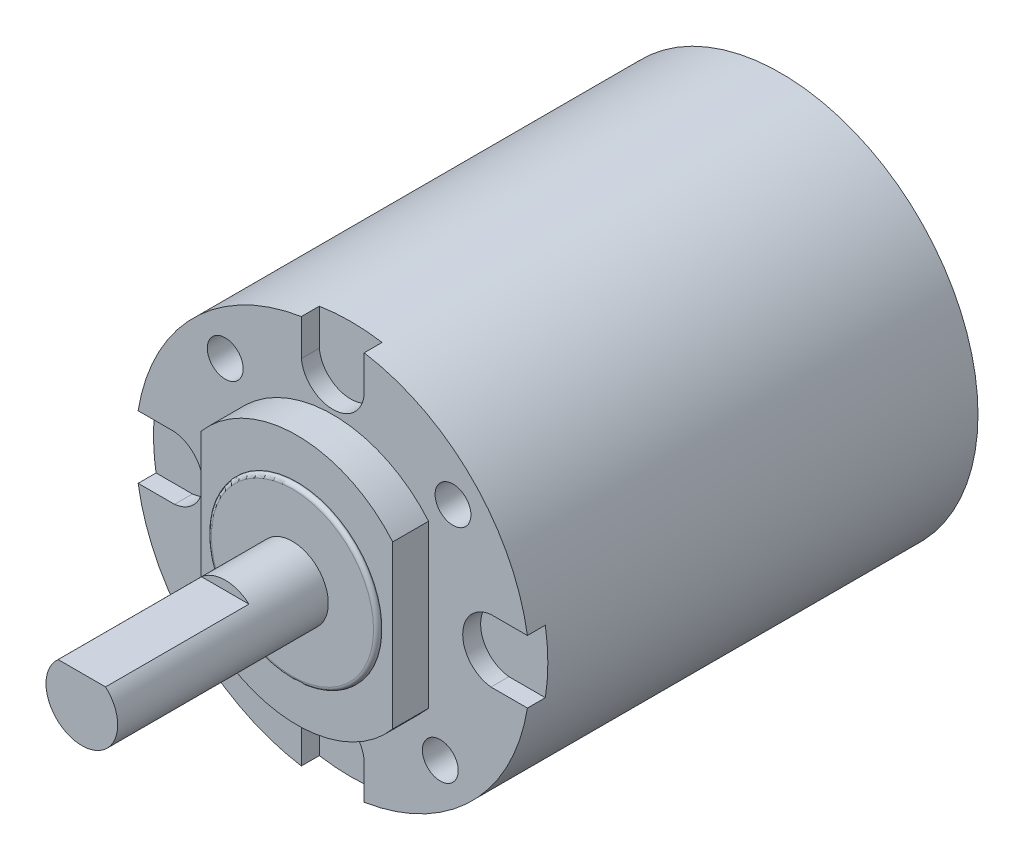
ISO-10303-21;
HEADER;
FILE_DESCRIPTION(('STEP AP214'),'2;1');
FILE_NAME('part.step','',(''),(''),'','','');
FILE_SCHEMA(('AUTOMOTIVE_DESIGN { 1 0 10303 214 1 1 1 1 }'));
ENDSEC;
DATA;
#1=APPLICATION_CONTEXT('core data for automotive mechanical design processes');
#2=APPLICATION_PROTOCOL_DEFINITION('international standard','automotive_design',2000,#1);
#3=PRODUCT_CONTEXT('',#1,'mechanical');
#4=PRODUCT('Part','Part','',(#3));
#5=PRODUCT_RELATED_PRODUCT_CATEGORY('part','',(#4));
#6=PRODUCT_DEFINITION_FORMATION('','',#4);
#7=PRODUCT_DEFINITION_CONTEXT('part definition',#1,'design');
#8=PRODUCT_DEFINITION('design','',#6,#7);
#9=PRODUCT_DEFINITION_SHAPE('','',#8);
#10=(LENGTH_UNIT() NAMED_UNIT(*) SI_UNIT(.MILLI.,.METRE.));
#11=(NAMED_UNIT(*) PLANE_ANGLE_UNIT() SI_UNIT($,.RADIAN.));
#12=(NAMED_UNIT(*) SI_UNIT($,.STERADIAN.) SOLID_ANGLE_UNIT());
#13=UNCERTAINTY_MEASURE_WITH_UNIT(LENGTH_MEASURE(1.E-05),#10,'distance_accuracy_value','');
#14=(GEOMETRIC_REPRESENTATION_CONTEXT(3) GLOBAL_UNCERTAINTY_ASSIGNED_CONTEXT((#13)) GLOBAL_UNIT_ASSIGNED_CONTEXT((#10,
#11,#12)) REPRESENTATION_CONTEXT('',''));
#15=CARTESIAN_POINT('',(0.,0.,0.));
#16=DIRECTION('',(0.,0.,1.));
#17=DIRECTION('',(1.,0.,0.));
#18=AXIS2_PLACEMENT_3D('',#15,#16,#17);
#19=CARTESIAN_POINT('',(0.,0.,39.000000376));
#20=DIRECTION('',(0.,0.,1.));
#21=DIRECTION('',(1.,0.,0.));
#22=AXIS2_PLACEMENT_3D('',#19,#20,#21);
#23=PLANE('',#22);
#24=CARTESIAN_POINT('',(0.,0.,39.000000376));
#25=DIRECTION('',(0.,0.,-1.));
#26=DIRECTION('',(-1.,0.,0.));
#27=AXIS2_PLACEMENT_3D('',#24,#25,#26);
#28=CIRCLE('',#27,2.);
#29=CARTESIAN_POINT('',(1.3228756555323,1.5,39.000000376));
#30=VERTEX_POINT('',#29);
#31=CARTESIAN_POINT('',(-1.3228756555323,1.5,39.000000376));
#32=VERTEX_POINT('',#31);
#33=EDGE_CURVE('E167',#30,#32,#28,.T.);
#34=ORIENTED_EDGE('',*,*,#33,.F.);
#35=DIRECTION('',(1.,0.,0.));
#36=VECTOR('',#35,1.);
#37=CARTESIAN_POINT('',(-1.3228756555323,1.5,39.000000376));
#38=LINE('',#37,#36);
#39=EDGE_CURVE('E178',#30,#32,#38,.F.);
#40=ORIENTED_EDGE('',*,*,#39,.T.);
#41=EDGE_LOOP('',(#34,#40));
#42=FACE_BOUND('',#41,.T.);
#43=ADVANCED_FACE('F16',(#42),#23,.T.);
#44=CARTESIAN_POINT('',(0.,0.,31.000000376));
#45=DIRECTION('',(0.,0.,-1.));
#46=DIRECTION('',(-1.,0.,0.));
#47=AXIS2_PLACEMENT_3D('',#44,#45,#46);
#48=PLANE('',#47);
#49=DIRECTION('',(1.,0.,0.));
#50=VECTOR('',#49,1.);
#51=CARTESIAN_POINT('',(-1.3228756555323,1.5,31.000000376));
#52=LINE('',#51,#50);
#53=CARTESIAN_POINT('',(-1.3228756555323,1.5,31.000000376));
#54=VERTEX_POINT('',#53);
#55=CARTESIAN_POINT('',(1.3228756555323,1.5,31.000000376));
#56=VERTEX_POINT('',#55);
#57=EDGE_CURVE('E181',#54,#56,#52,.T.);
#58=ORIENTED_EDGE('',*,*,#57,.T.);
#59=CARTESIAN_POINT('',(0.,0.,31.000000376));
#60=DIRECTION('',(0.,0.,-1.));
#61=DIRECTION('',(-1.,0.,0.));
#62=AXIS2_PLACEMENT_3D('',#59,#60,#61);
#63=CIRCLE('',#62,2.);
#64=EDGE_CURVE('E185',#54,#56,#63,.T.);
#65=ORIENTED_EDGE('',*,*,#64,.F.);
#66=EDGE_LOOP('',(#58,#65));
#67=FACE_BOUND('',#66,.T.);
#68=ADVANCED_FACE('F342',(#67),#48,.F.);
#69=CARTESIAN_POINT('',(-1.3228756555323,1.5,31.000000376));
#70=DIRECTION('',(0.,-1.,0.));
#71=DIRECTION('',(0.,0.,-1.));
#72=AXIS2_PLACEMENT_3D('',#69,#70,#71);
#73=PLANE('',#72);
#74=DIRECTION('',(0.,0.,-1.));
#75=VECTOR('',#74,1.);
#76=CARTESIAN_POINT('',(1.3228756555323,1.5,39.000000376));
#77=LINE('',#76,#75);
#78=EDGE_CURVE('E177',#56,#30,#77,.F.);
#79=ORIENTED_EDGE('',*,*,#78,.F.);
#80=ORIENTED_EDGE('',*,*,#57,.F.);
#81=DIRECTION('',(0.,0.,-1.));
#82=VECTOR('',#81,1.);
#83=CARTESIAN_POINT('',(-1.3228756555323,1.5,39.000000376));
#84=LINE('',#83,#82);
#85=EDGE_CURVE('E175',#32,#54,#84,.T.);
#86=ORIENTED_EDGE('',*,*,#85,.F.);
#87=ORIENTED_EDGE('',*,*,#39,.F.);
#88=EDGE_LOOP('',(#79,#80,#86,#87));
#89=FACE_BOUND('',#88,.T.);
#90=ADVANCED_FACE('F183',(#89),#73,.F.);
#91=CARTESIAN_POINT('',(0.,0.,39.000000376));
#92=DIRECTION('',(0.,0.,-1.));
#93=DIRECTION('',(-1.,0.,0.));
#94=AXIS2_PLACEMENT_3D('',#91,#92,#93);
#95=CYLINDRICAL_SURFACE('',#94,2.);
#96=CARTESIAN_POINT('',(0.,0.,27.25));
#97=DIRECTION('',(0.,0.,-1.));
#98=DIRECTION('',(-1.,0.,0.));
#99=AXIS2_PLACEMENT_3D('',#96,#97,#98);
#100=CIRCLE('',#99,2.);
#101=CARTESIAN_POINT('',(-2.,0.,27.25));
#102=VERTEX_POINT('',#101);
#103=EDGE_CURVE('E194',#102,#102,#100,.T.);
#104=ORIENTED_EDGE('',*,*,#103,.F.);
#105=EDGE_LOOP('',(#104));
#106=FACE_BOUND('',#105,.T.);
#107=ORIENTED_EDGE('',*,*,#64,.T.);
#108=ORIENTED_EDGE('',*,*,#78,.T.);
#109=ORIENTED_EDGE('',*,*,#33,.T.);
#110=ORIENTED_EDGE('',*,*,#85,.T.);
#111=EDGE_LOOP('',(#107,#108,#109,#110));
#112=FACE_BOUND('',#111,.T.);
#113=ADVANCED_FACE('F173',(#106,#112),#95,.T.);
#114=CARTESIAN_POINT('',(0.,0.,27.25));
#115=DIRECTION('',(0.,0.,1.));
#116=DIRECTION('',(1.,0.,0.));
#117=AXIS2_PLACEMENT_3D('',#114,#115,#116);
#118=PLANE('',#117);
#119=CARTESIAN_POINT('',(0.,0.,27.25));
#120=DIRECTION('',(0.,0.,-1.));
#121=DIRECTION('',(-1.,0.,0.));
#122=AXIS2_PLACEMENT_3D('',#119,#120,#121);
#123=CIRCLE('',#122,4.52443610257577);
#124=CARTESIAN_POINT('',(-4.52443610257577,0.,27.25));
#125=VERTEX_POINT('',#124);
#126=CARTESIAN_POINT('',(4.52443610257577,0.,27.25));
#127=VERTEX_POINT('',#126);
#128=EDGE_CURVE('E306',#125,#127,#123,.T.);
#129=ORIENTED_EDGE('',*,*,#128,.F.);
#130=CARTESIAN_POINT('',(0.,0.,27.25));
#131=DIRECTION('',(0.,0.,-1.));
#132=DIRECTION('',(1.,0.,0.));
#133=AXIS2_PLACEMENT_3D('',#130,#131,#132);
#134=CIRCLE('',#133,4.52443610257577);
#135=EDGE_CURVE('E313',#127,#125,#134,.T.);
#136=ORIENTED_EDGE('',*,*,#135,.F.);
#137=EDGE_LOOP('',(#129,#136));
#138=FACE_BOUND('',#137,.T.);
#139=ORIENTED_EDGE('',*,*,#103,.T.);
#140=EDGE_LOOP('',(#139));
#141=FACE_BOUND('',#140,.T.);
#142=ADVANCED_FACE('F317',(#138,#141),#118,.T.);
#143=CARTESIAN_POINT('',(0.,0.,27.0341));
#144=DIRECTION('',(0.,0.,1.));
#145=DIRECTION('',(1.,0.,0.));
#146=AXIS2_PLACEMENT_3D('',#143,#144,#145);
#147=TOROIDAL_SURFACE('',#146,4.52443610257577,0.2159);
#148=CARTESIAN_POINT('',(0.,0.,27.0341));
#149=DIRECTION('',(0.,0.,-1.));
#150=DIRECTION('',(-1.,0.,0.));
#151=AXIS2_PLACEMENT_3D('',#148,#149,#150);
#152=CIRCLE('',#151,4.74033610257577);
#153=CARTESIAN_POINT('',(-4.74033610257577,0.,27.0341));
#154=VERTEX_POINT('',#153);
#155=EDGE_CURVE('E304',#154,#154,#152,.T.);
#156=ORIENTED_EDGE('',*,*,#155,.F.);
#157=EDGE_LOOP('',(#156));
#158=FACE_BOUND('',#157,.T.);
#159=ORIENTED_EDGE('',*,*,#135,.T.);
#160=ORIENTED_EDGE('',*,*,#128,.T.);
#161=EDGE_LOOP('',(#159,#160));
#162=FACE_BOUND('',#161,.T.);
#163=ADVANCED_FACE('F312',(#158,#162),#147,.T.);
#164=CARTESIAN_POINT('',(0.,0.,27.25));
#165=DIRECTION('',(0.,0.,-1.));
#166=DIRECTION('',(-1.,0.,0.));
#167=AXIS2_PLACEMENT_3D('',#164,#165,#166);
#168=CYLINDRICAL_SURFACE('',#167,4.74033610257577);
#169=ORIENTED_EDGE('',*,*,#155,.T.);
#170=EDGE_LOOP('',(#169));
#171=FACE_BOUND('',#170,.T.);
#172=CARTESIAN_POINT('',(0.,0.,27.));
#173=DIRECTION('',(0.,0.,-1.));
#174=DIRECTION('',(-1.,0.,0.));
#175=AXIS2_PLACEMENT_3D('',#172,#173,#174);
#176=CIRCLE('',#175,4.74033610257577);
#177=CARTESIAN_POINT('',(-4.74033610257577,0.,27.));
#178=VERTEX_POINT('',#177);
#179=EDGE_CURVE('E300',#178,#178,#176,.F.);
#180=ORIENTED_EDGE('',*,*,#179,.T.);
#181=EDGE_LOOP('',(#180));
#182=FACE_BOUND('',#181,.T.);
#183=ADVANCED_FACE('F463',(#171,#182),#168,.T.);
#184=CARTESIAN_POINT('',(0.,-2.20309881449055E-13,27.));
#185=DIRECTION('',(0.,0.,-1.));
#186=DIRECTION('',(-1.,0.,0.));
#187=AXIS2_PLACEMENT_3D('',#184,#185,#186);
#188=PLANE('',#187);
#189=DIRECTION('',(0.,1.,0.));
#190=VECTOR('',#189,1.);
#191=CARTESIAN_POINT('',(-5.34624861618121,4.51858669652144,27.));
#192=LINE('',#191,#190);
#193=CARTESIAN_POINT('',(-5.34624861618121,4.51858669652144,27.));
#194=VERTEX_POINT('',#193);
#195=CARTESIAN_POINT('',(-5.34624861618121,-4.51858669652144,27.));
#196=VERTEX_POINT('',#195);
#197=EDGE_CURVE('E481',#194,#196,#192,.F.);
#198=ORIENTED_EDGE('',*,*,#197,.T.);
#199=CARTESIAN_POINT('',(0.,0.,27.));
#200=DIRECTION('',(0.,0.,-1.));
#201=DIRECTION('',(-1.,0.,0.));
#202=AXIS2_PLACEMENT_3D('',#199,#200,#201);
#203=CIRCLE('',#202,7.00000000000001);
#204=CARTESIAN_POINT('',(5.34624861618121,-4.51858669652144,27.));
#205=VERTEX_POINT('',#204);
#206=EDGE_CURVE('E290',#205,#196,#203,.T.);
#207=ORIENTED_EDGE('',*,*,#206,.F.);
#208=DIRECTION('',(0.,1.,0.));
#209=VECTOR('',#208,1.);
#210=CARTESIAN_POINT('',(5.34624861618121,4.51858669652144,27.));
#211=LINE('',#210,#209);
#212=CARTESIAN_POINT('',(5.34624861618121,4.51858669652144,27.));
#213=VERTEX_POINT('',#212);
#214=EDGE_CURVE('E298',#205,#213,#211,.T.);
#215=ORIENTED_EDGE('',*,*,#214,.T.);
#216=CARTESIAN_POINT('',(0.,-2.20309881449055E-13,27.));
#217=DIRECTION('',(0.,0.,-1.));
#218=DIRECTION('',(-1.,0.,0.));
#219=AXIS2_PLACEMENT_3D('',#216,#217,#218);
#220=CIRCLE('',#219,7.00000000000014);
#221=EDGE_CURVE('E295',#194,#213,#220,.T.);
#222=ORIENTED_EDGE('',*,*,#221,.F.);
#223=EDGE_LOOP('',(#198,#207,#215,#222));
#224=FACE_BOUND('',#223,.T.);
#225=ORIENTED_EDGE('',*,*,#179,.F.);
#226=EDGE_LOOP('',(#225));
#227=FACE_BOUND('',#226,.T.);
#228=ADVANCED_FACE('F460',(#224,#227),#188,.F.);
#229=CARTESIAN_POINT('',(-1.7525,8.82772585380856,24.));
#230=DIRECTION('',(-1.,0.,0.));
#231=DIRECTION('',(0.,0.,1.));
#232=AXIS2_PLACEMENT_3D('',#229,#230,#231);
#233=PLANE('',#232);
#234=DIRECTION('',(0.,0.,1.));
#235=VECTOR('',#234,1.);
#236=CARTESIAN_POINT('',(-1.7525,8.82772585380856,24.));
#237=LINE('',#236,#235);
#238=CARTESIAN_POINT('',(-1.7525,8.82772585380855,25.));
#239=VERTEX_POINT('',#238);
#240=CARTESIAN_POINT('',(-1.7525,8.82772585380855,24.));
#241=VERTEX_POINT('',#240);
#242=EDGE_CURVE('E503',#239,#241,#237,.F.);
#243=ORIENTED_EDGE('',*,*,#242,.T.);
#244=DIRECTION('',(0.,1.,0.));
#245=VECTOR('',#244,1.);
#246=CARTESIAN_POINT('',(-1.7525,9.01114588014021,24.));
#247=LINE('',#246,#245);
#248=CARTESIAN_POINT('',(-1.7525,10.8595001611492,24.));
#249=VERTEX_POINT('',#248);
#250=EDGE_CURVE('E284',#249,#241,#247,.F.);
#251=ORIENTED_EDGE('',*,*,#250,.F.);
#252=DIRECTION('',(0.,0.,1.));
#253=VECTOR('',#252,1.);
#254=CARTESIAN_POINT('',(-1.7525,10.8595001611492,24.));
#255=LINE('',#254,#253);
#256=CARTESIAN_POINT('',(-1.7525,10.8595001611492,25.));
#257=VERTEX_POINT('',#256);
#258=EDGE_CURVE('E303',#257,#249,#255,.F.);
#259=ORIENTED_EDGE('',*,*,#258,.F.);
#260=DIRECTION('',(0.,1.,0.));
#261=VECTOR('',#260,1.);
#262=CARTESIAN_POINT('',(-1.7525,0.,25.));
#263=LINE('',#262,#261);
#264=EDGE_CURVE('E264',#239,#257,#263,.T.);
#265=ORIENTED_EDGE('',*,*,#264,.F.);
#266=EDGE_LOOP('',(#243,#251,#259,#265));
#267=FACE_BOUND('',#266,.T.);
#268=ADVANCED_FACE('F456',(#267),#233,.F.);
#269=CARTESIAN_POINT('',(-1.75250000000006,-8.82772585380855,24.));
#270=DIRECTION('',(-1.,0.,0.));
#271=DIRECTION('',(0.,-1.,0.));
#272=AXIS2_PLACEMENT_3D('',#269,#270,#271);
#273=PLANE('',#272);
#274=DIRECTION('',(0.,0.,1.));
#275=VECTOR('',#274,1.);
#276=CARTESIAN_POINT('',(-1.75250000000008,-10.8595001611492,24.));
#277=LINE('',#276,#275);
#278=CARTESIAN_POINT('',(-1.75250000000007,-10.8595001611492,24.));
#279=VERTEX_POINT('',#278);
#280=CARTESIAN_POINT('',(-1.75250000000007,-10.8595001611492,25.));
#281=VERTEX_POINT('',#280);
#282=EDGE_CURVE('E485',#279,#281,#277,.T.);
#283=ORIENTED_EDGE('',*,*,#282,.F.);
#284=DIRECTION('',(0.,1.,0.));
#285=VECTOR('',#284,1.);
#286=CARTESIAN_POINT('',(-1.75250000000006,-9.01114588014021,24.));
#287=LINE('',#286,#285);
#288=CARTESIAN_POINT('',(-1.75250000000006,-8.82772585380855,24.));
#289=VERTEX_POINT('',#288);
#290=EDGE_CURVE('E278',#289,#279,#287,.F.);
#291=ORIENTED_EDGE('',*,*,#290,.F.);
#292=DIRECTION('',(0.,0.,1.));
#293=VECTOR('',#292,1.);
#294=CARTESIAN_POINT('',(-1.75250000000006,-8.82772585380855,24.));
#295=LINE('',#294,#293);
#296=CARTESIAN_POINT('',(-1.75250000000007,-8.82772585380861,25.));
#297=VERTEX_POINT('',#296);
#298=EDGE_CURVE('E487',#289,#297,#295,.T.);
#299=ORIENTED_EDGE('',*,*,#298,.T.);
#300=DIRECTION('',(0.,1.,0.));
#301=VECTOR('',#300,1.);
#302=CARTESIAN_POINT('',(-1.75250000000007,0.,25.));
#303=LINE('',#302,#301);
#304=EDGE_CURVE('E255',#281,#297,#303,.T.);
#305=ORIENTED_EDGE('',*,*,#304,.F.);
#306=EDGE_LOOP('',(#283,#291,#299,#305));
#307=FACE_BOUND('',#306,.T.);
#308=ADVANCED_FACE('F452',(#307),#273,.F.);
#309=CARTESIAN_POINT('',(0.,-9.01114588014021,24.));
#310=DIRECTION('',(0.,0.,1.));
#311=DIRECTION('',(1.,0.,0.));
#312=AXIS2_PLACEMENT_3D('',#309,#310,#311);
#313=CYLINDRICAL_SURFACE('',#312,1.76207240375062);
#314=ORIENTED_EDGE('',*,*,#298,.F.);
#315=CARTESIAN_POINT('',(0.,-9.01114588014021,24.));
#316=DIRECTION('',(0.,0.,1.));
#317=DIRECTION('',(1.,0.,0.));
#318=AXIS2_PLACEMENT_3D('',#315,#316,#317);
#319=CIRCLE('',#318,1.76207240375062);
#320=CARTESIAN_POINT('',(1.75249999999993,-8.8277258538085,24.));
#321=VERTEX_POINT('',#320);
#322=EDGE_CURVE('E275',#321,#289,#319,.T.);
#323=ORIENTED_EDGE('',*,*,#322,.F.);
#324=DIRECTION('',(0.,0.,1.));
#325=VECTOR('',#324,1.);
#326=CARTESIAN_POINT('',(1.75249999999994,-8.82772585380857,24.));
#327=LINE('',#326,#325);
#328=CARTESIAN_POINT('',(1.75249999999994,-8.82772585380857,25.));
#329=VERTEX_POINT('',#328);
#330=EDGE_CURVE('E491',#321,#329,#327,.T.);
#331=ORIENTED_EDGE('',*,*,#330,.T.);
#332=CARTESIAN_POINT('',(0.,-9.01114588014021,25.));
#333=DIRECTION('',(0.,0.,1.));
#334=DIRECTION('',(1.,0.,0.));
#335=AXIS2_PLACEMENT_3D('',#332,#333,#334);
#336=CIRCLE('',#335,1.76207240375062);
#337=EDGE_CURVE('E251',#297,#329,#336,.F.);
#338=ORIENTED_EDGE('',*,*,#337,.F.);
#339=EDGE_LOOP('',(#314,#323,#331,#338));
#340=FACE_BOUND('',#339,.T.);
#341=ADVANCED_FACE('F448',(#340),#313,.F.);
#342=CARTESIAN_POINT('',(1.75249999999994,-8.82772585380857,24.));
#343=DIRECTION('',(1.,0.,0.));
#344=DIRECTION('',(0.,1.,0.));
#345=AXIS2_PLACEMENT_3D('',#342,#343,#344);
#346=PLANE('',#345);
#347=ORIENTED_EDGE('',*,*,#330,.F.);
#348=DIRECTION('',(0.,1.,0.));
#349=VECTOR('',#348,1.);
#350=CARTESIAN_POINT('',(1.75249999999992,-9.01114588014021,24.));
#351=LINE('',#350,#349);
#352=CARTESIAN_POINT('',(1.75249999999992,-10.8595001611492,24.));
#353=VERTEX_POINT('',#352);
#354=EDGE_CURVE('E274',#353,#321,#351,.T.);
#355=ORIENTED_EDGE('',*,*,#354,.F.);
#356=DIRECTION('',(0.,0.,1.));
#357=VECTOR('',#356,1.);
#358=CARTESIAN_POINT('',(1.75249999999992,-10.8595001611492,24.));
#359=LINE('',#358,#357);
#360=CARTESIAN_POINT('',(1.75249999999993,-10.8595001611492,25.));
#361=VERTEX_POINT('',#360);
#362=EDGE_CURVE('E489',#361,#353,#359,.F.);
#363=ORIENTED_EDGE('',*,*,#362,.F.);
#364=DIRECTION('',(0.,1.,0.));
#365=VECTOR('',#364,1.);
#366=CARTESIAN_POINT('',(1.75249999999994,0.,25.));
#367=LINE('',#366,#365);
#368=EDGE_CURVE('E254',#329,#361,#367,.F.);
#369=ORIENTED_EDGE('',*,*,#368,.F.);
#370=EDGE_LOOP('',(#347,#355,#363,#369));
#371=FACE_BOUND('',#370,.T.);
#372=ADVANCED_FACE('F444',(#371),#346,.F.);
#373=CARTESIAN_POINT('',(8.82772585380855,-1.75250000000003,24.));
#374=DIRECTION('',(0.,-1.,0.));
#375=DIRECTION('',(1.,0.,0.));
#376=AXIS2_PLACEMENT_3D('',#373,#374,#375);
#377=PLANE('',#376);
#378=DIRECTION('',(0.,0.,1.));
#379=VECTOR('',#378,1.);
#380=CARTESIAN_POINT('',(10.8595001611492,-1.75250000000004,24.));
#381=LINE('',#380,#379);
#382=CARTESIAN_POINT('',(10.8595001611492,-1.75250000000003,24.));
#383=VERTEX_POINT('',#382);
#384=CARTESIAN_POINT('',(10.8595001611492,-1.75250000000004,25.));
#385=VERTEX_POINT('',#384);
#386=EDGE_CURVE('E493',#383,#385,#381,.T.);
#387=ORIENTED_EDGE('',*,*,#386,.F.);
#388=DIRECTION('',(1.,0.,0.));
#389=VECTOR('',#388,1.);
#390=CARTESIAN_POINT('',(9.01114588014021,-1.75250000000003,24.));
#391=LINE('',#390,#389);
#392=CARTESIAN_POINT('',(8.82772585380855,-1.75250000000003,24.));
#393=VERTEX_POINT('',#392);
#394=EDGE_CURVE('E283',#393,#383,#391,.T.);
#395=ORIENTED_EDGE('',*,*,#394,.F.);
#396=DIRECTION('',(0.,0.,1.));
#397=VECTOR('',#396,1.);
#398=CARTESIAN_POINT('',(8.82772585380855,-1.75250000000003,24.));
#399=LINE('',#398,#397);
#400=CARTESIAN_POINT('',(8.82772585380859,-1.75250000000003,25.));
#401=VERTEX_POINT('',#400);
#402=EDGE_CURVE('E495',#393,#401,#399,.T.);
#403=ORIENTED_EDGE('',*,*,#402,.T.);
#404=DIRECTION('',(1.,0.,0.));
#405=VECTOR('',#404,1.);
#406=CARTESIAN_POINT('',(0.,-1.75250000000004,25.));
#407=LINE('',#406,#405);
#408=EDGE_CURVE('E250',#385,#401,#407,.F.);
#409=ORIENTED_EDGE('',*,*,#408,.F.);
#410=EDGE_LOOP('',(#387,#395,#403,#409));
#411=FACE_BOUND('',#410,.T.);
#412=ADVANCED_FACE('F440',(#411),#377,.F.);
#413=CARTESIAN_POINT('',(9.01114588014021,0.,24.));
#414=DIRECTION('',(0.,0.,1.));
#415=DIRECTION('',(1.,0.,0.));
#416=AXIS2_PLACEMENT_3D('',#413,#414,#415);
#417=CYLINDRICAL_SURFACE('',#416,1.76207240375062);
#418=ORIENTED_EDGE('',*,*,#402,.F.);
#419=CARTESIAN_POINT('',(9.01114588014021,0.,24.));
#420=DIRECTION('',(0.,0.,1.));
#421=DIRECTION('',(1.,0.,0.));
#422=AXIS2_PLACEMENT_3D('',#419,#420,#421);
#423=CIRCLE('',#422,1.76207240375062);
#424=CARTESIAN_POINT('',(8.82772585380853,1.75249999999997,24.));
#425=VERTEX_POINT('',#424);
#426=EDGE_CURVE('E280',#425,#393,#423,.T.);
#427=ORIENTED_EDGE('',*,*,#426,.F.);
#428=DIRECTION('',(0.,0.,1.));
#429=VECTOR('',#428,1.);
#430=CARTESIAN_POINT('',(8.82772585380856,1.75249999999997,24.));
#431=LINE('',#430,#429);
#432=CARTESIAN_POINT('',(8.82772585380856,1.75249999999997,25.));
#433=VERTEX_POINT('',#432);
#434=EDGE_CURVE('E499',#425,#433,#431,.T.);
#435=ORIENTED_EDGE('',*,*,#434,.T.);
#436=CARTESIAN_POINT('',(9.01114588014021,0.,25.));
#437=DIRECTION('',(0.,0.,1.));
#438=DIRECTION('',(1.,0.,0.));
#439=AXIS2_PLACEMENT_3D('',#436,#437,#438);
#440=CIRCLE('',#439,1.76207240375062);
#441=EDGE_CURVE('E246',#401,#433,#440,.F.);
#442=ORIENTED_EDGE('',*,*,#441,.F.);
#443=EDGE_LOOP('',(#418,#427,#435,#442));
#444=FACE_BOUND('',#443,.T.);
#445=ADVANCED_FACE('F436',(#444),#417,.F.);
#446=CARTESIAN_POINT('',(8.82772585380856,1.75249999999997,24.));
#447=DIRECTION('',(0.,1.,0.));
#448=DIRECTION('',(-1.,0.,0.));
#449=AXIS2_PLACEMENT_3D('',#446,#447,#448);
#450=PLANE('',#449);
#451=ORIENTED_EDGE('',*,*,#434,.F.);
#452=DIRECTION('',(1.,0.,0.));
#453=VECTOR('',#452,1.);
#454=CARTESIAN_POINT('',(9.01114588014021,1.75249999999996,24.));
#455=LINE('',#454,#453);
#456=CARTESIAN_POINT('',(10.8595001611492,1.75249999999996,24.));
#457=VERTEX_POINT('',#456);
#458=EDGE_CURVE('E279',#457,#425,#455,.F.);
#459=ORIENTED_EDGE('',*,*,#458,.F.);
#460=DIRECTION('',(0.,0.,1.));
#461=VECTOR('',#460,1.);
#462=CARTESIAN_POINT('',(10.8595001611492,1.75249999999996,24.));
#463=LINE('',#462,#461);
#464=CARTESIAN_POINT('',(10.8595001611492,1.75249999999997,25.));
#465=VERTEX_POINT('',#464);
#466=EDGE_CURVE('E497',#465,#457,#463,.F.);
#467=ORIENTED_EDGE('',*,*,#466,.F.);
#468=DIRECTION('',(1.,0.,0.));
#469=VECTOR('',#468,1.);
#470=CARTESIAN_POINT('',(0.,1.75249999999997,25.));
#471=LINE('',#470,#469);
#472=EDGE_CURVE('E249',#433,#465,#471,.T.);
#473=ORIENTED_EDGE('',*,*,#472,.F.);
#474=EDGE_LOOP('',(#451,#459,#467,#473));
#475=FACE_BOUND('',#474,.T.);
#476=ADVANCED_FACE('F432',(#475),#450,.F.);
#477=CARTESIAN_POINT('',(1.7525,8.82772585380856,24.));
#478=DIRECTION('',(1.,0.,0.));
#479=DIRECTION('',(0.,0.,-1.));
#480=AXIS2_PLACEMENT_3D('',#477,#478,#479);
#481=PLANE('',#480);
#482=DIRECTION('',(0.,0.,-1.));
#483=VECTOR('',#482,1.);
#484=CARTESIAN_POINT('',(1.7525,10.8595001611492,24.));
#485=LINE('',#484,#483);
#486=CARTESIAN_POINT('',(1.7525,10.8595001611492,24.));
#487=VERTEX_POINT('',#486);
#488=CARTESIAN_POINT('',(1.7525,10.8595001611492,25.));
#489=VERTEX_POINT('',#488);
#490=EDGE_CURVE('E501',#487,#489,#485,.F.);
#491=ORIENTED_EDGE('',*,*,#490,.F.);
#492=DIRECTION('',(0.,1.,0.));
#493=VECTOR('',#492,1.);
#494=CARTESIAN_POINT('',(1.7525,9.01114588014021,24.));
#495=LINE('',#494,#493);
#496=CARTESIAN_POINT('',(1.7525,8.82772585380855,24.));
#497=VERTEX_POINT('',#496);
#498=EDGE_CURVE('E288',#497,#487,#495,.T.);
#499=ORIENTED_EDGE('',*,*,#498,.F.);
#500=DIRECTION('',(0.,0.,1.));
#501=VECTOR('',#500,1.);
#502=CARTESIAN_POINT('',(1.7525,8.82772585380856,24.));
#503=LINE('',#502,#501);
#504=CARTESIAN_POINT('',(1.7525,8.82772585380855,25.));
#505=VERTEX_POINT('',#504);
#506=EDGE_CURVE('E483',#497,#505,#503,.T.);
#507=ORIENTED_EDGE('',*,*,#506,.T.);
#508=DIRECTION('',(0.,1.,0.));
#509=VECTOR('',#508,1.);
#510=CARTESIAN_POINT('',(1.7525,0.,25.));
#511=LINE('',#510,#509);
#512=EDGE_CURVE('E245',#489,#505,#511,.F.);
#513=ORIENTED_EDGE('',*,*,#512,.F.);
#514=EDGE_LOOP('',(#491,#499,#507,#513));
#515=FACE_BOUND('',#514,.T.);
#516=ADVANCED_FACE('F428',(#515),#481,.F.);
#517=CARTESIAN_POINT('',(0.,9.01114588014021,24.));
#518=DIRECTION('',(0.,0.,1.));
#519=DIRECTION('',(1.,0.,0.));
#520=AXIS2_PLACEMENT_3D('',#517,#518,#519);
#521=CYLINDRICAL_SURFACE('',#520,1.76207240375062);
#522=ORIENTED_EDGE('',*,*,#506,.F.);
#523=CARTESIAN_POINT('',(0.,9.01114588014021,24.));
#524=DIRECTION('',(0.,0.,1.));
#525=DIRECTION('',(1.,0.,0.));
#526=AXIS2_PLACEMENT_3D('',#523,#524,#525);
#527=CIRCLE('',#526,1.76207240375062);
#528=EDGE_CURVE('E285',#241,#497,#527,.T.);
#529=ORIENTED_EDGE('',*,*,#528,.F.);
#530=ORIENTED_EDGE('',*,*,#242,.F.);
#531=CARTESIAN_POINT('',(0.,9.01114588014021,25.));
#532=DIRECTION('',(0.,0.,1.));
#533=DIRECTION('',(1.,0.,0.));
#534=AXIS2_PLACEMENT_3D('',#531,#532,#533);
#535=CIRCLE('',#534,1.76207240375062);
#536=EDGE_CURVE('E242',#505,#239,#535,.F.);
#537=ORIENTED_EDGE('',*,*,#536,.F.);
#538=EDGE_LOOP('',(#522,#529,#530,#537));
#539=FACE_BOUND('',#538,.T.);
#540=ADVANCED_FACE('F424',(#539),#521,.F.);
#541=CARTESIAN_POINT('',(-5.34624861618121,4.51858669652144,27.));
#542=DIRECTION('',(1.,0.,0.));
#543=DIRECTION('',(0.,0.,-1.));
#544=AXIS2_PLACEMENT_3D('',#541,#542,#543);
#545=PLANE('',#544);
#546=DIRECTION('',(0.,0.,-1.));
#547=VECTOR('',#546,1.);
#548=CARTESIAN_POINT('',(-5.34624861618121,-4.51858669652144,27.));
#549=LINE('',#548,#547);
#550=CARTESIAN_POINT('',(-5.34624861618121,-4.51858669652144,25.));
#551=VERTEX_POINT('',#550);
#552=EDGE_CURVE('E293',#196,#551,#549,.T.);
#553=ORIENTED_EDGE('',*,*,#552,.F.);
#554=ORIENTED_EDGE('',*,*,#197,.F.);
#555=DIRECTION('',(0.,0.,-1.));
#556=VECTOR('',#555,1.);
#557=CARTESIAN_POINT('',(-5.34624861618121,4.51858669652144,27.));
#558=LINE('',#557,#556);
#559=CARTESIAN_POINT('',(-5.34624861618121,4.51858669652144,25.));
#560=VERTEX_POINT('',#559);
#561=EDGE_CURVE('E299',#560,#194,#558,.F.);
#562=ORIENTED_EDGE('',*,*,#561,.F.);
#563=DIRECTION('',(0.,1.,0.));
#564=VECTOR('',#563,1.);
#565=CARTESIAN_POINT('',(-5.34624861618121,0.,25.));
#566=LINE('',#565,#564);
#567=EDGE_CURVE('E241',#551,#560,#566,.T.);
#568=ORIENTED_EDGE('',*,*,#567,.F.);
#569=EDGE_LOOP('',(#553,#554,#562,#568));
#570=FACE_BOUND('',#569,.T.);
#571=ADVANCED_FACE('F420',(#570),#545,.F.);
#572=CARTESIAN_POINT('',(0.,-2.20309881449055E-13,27.));
#573=DIRECTION('',(0.,0.,-1.));
#574=DIRECTION('',(-1.,0.,0.));
#575=AXIS2_PLACEMENT_3D('',#572,#573,#574);
#576=CYLINDRICAL_SURFACE('',#575,7.00000000000014);
#577=ORIENTED_EDGE('',*,*,#221,.T.);
#578=DIRECTION('',(0.,0.,1.));
#579=VECTOR('',#578,1.);
#580=CARTESIAN_POINT('',(5.34624861618121,4.51858669652144,27.));
#581=LINE('',#580,#579);
#582=CARTESIAN_POINT('',(5.34624861618121,4.51858669652144,25.));
#583=VERTEX_POINT('',#582);
#584=EDGE_CURVE('E480',#213,#583,#581,.F.);
#585=ORIENTED_EDGE('',*,*,#584,.T.);
#586=CARTESIAN_POINT('',(0.,-2.20309881449055E-13,25.));
#587=DIRECTION('',(0.,0.,-1.));
#588=DIRECTION('',(-1.,0.,0.));
#589=AXIS2_PLACEMENT_3D('',#586,#587,#588);
#590=CIRCLE('',#589,7.00000000000014);
#591=EDGE_CURVE('E238',#560,#583,#590,.T.);
#592=ORIENTED_EDGE('',*,*,#591,.F.);
#593=ORIENTED_EDGE('',*,*,#561,.T.);
#594=EDGE_LOOP('',(#577,#585,#592,#593));
#595=FACE_BOUND('',#594,.T.);
#596=ADVANCED_FACE('F416',(#595),#576,.T.);
#597=CARTESIAN_POINT('',(5.34624861618121,4.51858669652144,27.));
#598=DIRECTION('',(-1.,0.,0.));
#599=DIRECTION('',(0.,0.,1.));
#600=AXIS2_PLACEMENT_3D('',#597,#598,#599);
#601=PLANE('',#600);
#602=ORIENTED_EDGE('',*,*,#584,.F.);
#603=ORIENTED_EDGE('',*,*,#214,.F.);
#604=DIRECTION('',(0.,0.,-1.));
#605=VECTOR('',#604,1.);
#606=CARTESIAN_POINT('',(5.34624861618121,-4.51858669652144,27.));
#607=LINE('',#606,#605);
#608=CARTESIAN_POINT('',(5.34624861618121,-4.51858669652144,25.));
#609=VERTEX_POINT('',#608);
#610=EDGE_CURVE('E294',#609,#205,#607,.F.);
#611=ORIENTED_EDGE('',*,*,#610,.F.);
#612=DIRECTION('',(0.,1.,0.));
#613=VECTOR('',#612,1.);
#614=CARTESIAN_POINT('',(5.34624861618121,0.,25.));
#615=LINE('',#614,#613);
#616=EDGE_CURVE('E237',#583,#609,#615,.F.);
#617=ORIENTED_EDGE('',*,*,#616,.F.);
#618=EDGE_LOOP('',(#602,#603,#611,#617));
#619=FACE_BOUND('',#618,.T.);
#620=ADVANCED_FACE('F412',(#619),#601,.F.);
#621=CARTESIAN_POINT('',(0.,0.,27.));
#622=DIRECTION('',(0.,0.,-1.));
#623=DIRECTION('',(-1.,0.,0.));
#624=AXIS2_PLACEMENT_3D('',#621,#622,#623);
#625=CYLINDRICAL_SURFACE('',#624,7.00000000000001);
#626=ORIENTED_EDGE('',*,*,#206,.T.);
#627=ORIENTED_EDGE('',*,*,#552,.T.);
#628=CARTESIAN_POINT('',(0.,0.,25.));
#629=DIRECTION('',(0.,0.,-1.));
#630=DIRECTION('',(-1.,0.,0.));
#631=AXIS2_PLACEMENT_3D('',#628,#629,#630);
#632=CIRCLE('',#631,7.00000000000001);
#633=EDGE_CURVE('E234',#609,#551,#632,.T.);
#634=ORIENTED_EDGE('',*,*,#633,.F.);
#635=ORIENTED_EDGE('',*,*,#610,.T.);
#636=EDGE_LOOP('',(#626,#627,#634,#635));
#637=FACE_BOUND('',#636,.T.);
#638=ADVANCED_FACE('F408',(#637),#625,.T.);
#639=CARTESIAN_POINT('',(-9.01114588014021,0.,24.));
#640=DIRECTION('',(0.,0.,1.));
#641=DIRECTION('',(1.,0.,0.));
#642=AXIS2_PLACEMENT_3D('',#639,#640,#641);
#643=CYLINDRICAL_SURFACE('',#642,1.76207240375062);
#644=CARTESIAN_POINT('',(-9.01114588014021,0.,24.));
#645=DIRECTION('',(0.,0.,1.));
#646=DIRECTION('',(1.,0.,0.));
#647=AXIS2_PLACEMENT_3D('',#644,#645,#646);
#648=CIRCLE('',#647,1.76207240375062);
#649=CARTESIAN_POINT('',(-8.82772585380847,-1.7524999999999,24.));
#650=VERTEX_POINT('',#649);
#651=CARTESIAN_POINT('',(-8.82772585380854,1.75250000000009,24.));
#652=VERTEX_POINT('',#651);
#653=EDGE_CURVE('E230',#650,#652,#648,.T.);
#654=ORIENTED_EDGE('',*,*,#653,.F.);
#655=DIRECTION('',(0.,0.,1.));
#656=VECTOR('',#655,1.);
#657=CARTESIAN_POINT('',(-8.82772585380857,-1.75249999999991,24.));
#658=LINE('',#657,#656);
#659=CARTESIAN_POINT('',(-8.82772585380857,-1.75249999999991,25.));
#660=VERTEX_POINT('',#659);
#661=EDGE_CURVE('E289',#650,#660,#658,.T.);
#662=ORIENTED_EDGE('',*,*,#661,.T.);
#663=CARTESIAN_POINT('',(-9.01114588014021,0.,25.));
#664=DIRECTION('',(0.,0.,1.));
#665=DIRECTION('',(1.,0.,0.));
#666=AXIS2_PLACEMENT_3D('',#663,#664,#665);
#667=CIRCLE('',#666,1.76207240375062);
#668=CARTESIAN_POINT('',(-8.82772585380864,1.7525000000001,25.));
#669=VERTEX_POINT('',#668);
#670=EDGE_CURVE('E256',#669,#660,#667,.F.);
#671=ORIENTED_EDGE('',*,*,#670,.F.);
#672=DIRECTION('',(0.,0.,1.));
#673=VECTOR('',#672,1.);
#674=CARTESIAN_POINT('',(-8.82772585380854,1.75250000000009,24.));
#675=LINE('',#674,#673);
#676=EDGE_CURVE('E513',#669,#652,#675,.F.);
#677=ORIENTED_EDGE('',*,*,#676,.T.);
#678=EDGE_LOOP('',(#654,#662,#671,#677));
#679=FACE_BOUND('',#678,.T.);
#680=ADVANCED_FACE('F404',(#679),#643,.F.);
#681=CARTESIAN_POINT('',(-8.82772585380854,1.75250000000009,24.));
#682=DIRECTION('',(0.,1.,0.));
#683=DIRECTION('',(-1.,0.,0.));
#684=AXIS2_PLACEMENT_3D('',#681,#682,#683);
#685=PLANE('',#684);
#686=DIRECTION('',(0.,0.,1.));
#687=VECTOR('',#686,1.);
#688=CARTESIAN_POINT('',(-10.8595001611492,1.75250000000011,24.));
#689=LINE('',#688,#687);
#690=CARTESIAN_POINT('',(-10.8595001611492,1.7525000000001,24.));
#691=VERTEX_POINT('',#690);
#692=CARTESIAN_POINT('',(-10.8595001611492,1.75250000000011,25.));
#693=VERTEX_POINT('',#692);
#694=EDGE_CURVE('E514',#691,#693,#689,.T.);
#695=ORIENTED_EDGE('',*,*,#694,.F.);
#696=DIRECTION('',(1.,0.,0.));
#697=VECTOR('',#696,1.);
#698=CARTESIAN_POINT('',(-9.01114588014021,1.75250000000009,24.));
#699=LINE('',#698,#697);
#700=EDGE_CURVE('E233',#652,#691,#699,.F.);
#701=ORIENTED_EDGE('',*,*,#700,.F.);
#702=ORIENTED_EDGE('',*,*,#676,.F.);
#703=DIRECTION('',(1.,0.,0.));
#704=VECTOR('',#703,1.);
#705=CARTESIAN_POINT('',(0.,1.75250000000012,25.));
#706=LINE('',#705,#704);
#707=EDGE_CURVE('E260',#693,#669,#706,.T.);
#708=ORIENTED_EDGE('',*,*,#707,.F.);
#709=EDGE_LOOP('',(#695,#701,#702,#708));
#710=FACE_BOUND('',#709,.T.);
#711=ADVANCED_FACE('F400',(#710),#685,.F.);
#712=CARTESIAN_POINT('',(-8.82772585380857,-1.75249999999991,24.));
#713=DIRECTION('',(0.,-1.,0.));
#714=DIRECTION('',(1.,0.,0.));
#715=AXIS2_PLACEMENT_3D('',#712,#713,#714);
#716=PLANE('',#715);
#717=ORIENTED_EDGE('',*,*,#661,.F.);
#718=DIRECTION('',(1.,0.,0.));
#719=VECTOR('',#718,1.);
#720=CARTESIAN_POINT('',(-9.01114588014021,-1.75249999999988,24.));
#721=LINE('',#720,#719);
#722=CARTESIAN_POINT('',(-10.8595001611492,-1.75249999999988,24.));
#723=VERTEX_POINT('',#722);
#724=EDGE_CURVE('E229',#723,#650,#721,.T.);
#725=ORIENTED_EDGE('',*,*,#724,.F.);
#726=DIRECTION('',(0.,0.,1.));
#727=VECTOR('',#726,1.);
#728=CARTESIAN_POINT('',(-10.8595001611492,-1.75249999999988,24.));
#729=LINE('',#728,#727);
#730=CARTESIAN_POINT('',(-10.8595001611492,-1.7524999999999,25.));
#731=VERTEX_POINT('',#730);
#732=EDGE_CURVE('E36',#731,#723,#729,.F.);
#733=ORIENTED_EDGE('',*,*,#732,.F.);
#734=DIRECTION('',(1.,0.,0.));
#735=VECTOR('',#734,1.);
#736=CARTESIAN_POINT('',(0.,-1.75249999999991,25.));
#737=LINE('',#736,#735);
#738=EDGE_CURVE('E259',#660,#731,#737,.F.);
#739=ORIENTED_EDGE('',*,*,#738,.F.);
#740=EDGE_LOOP('',(#717,#725,#733,#739));
#741=FACE_BOUND('',#740,.T.);
#742=ADVANCED_FACE('F396',(#741),#716,.F.);
#743=CARTESIAN_POINT('',(0.,9.01114588014021,24.));
#744=DIRECTION('',(0.,0.,1.));
#745=DIRECTION('',(1.,0.,0.));
#746=AXIS2_PLACEMENT_3D('',#743,#744,#745);
#747=PLANE('',#746);
#748=CARTESIAN_POINT('',(0.,0.,24.));
#749=DIRECTION('',(0.,0.,-1.));
#750=DIRECTION('',(-1.,0.,0.));
#751=AXIS2_PLACEMENT_3D('',#748,#749,#750);
#752=CIRCLE('',#751,11.);
#753=EDGE_CURVE('E223',#249,#487,#752,.T.);
#754=ORIENTED_EDGE('',*,*,#753,.F.);
#755=ORIENTED_EDGE('',*,*,#250,.T.);
#756=ORIENTED_EDGE('',*,*,#528,.T.);
#757=ORIENTED_EDGE('',*,*,#498,.T.);
#758=EDGE_LOOP('',(#754,#755,#756,#757));
#759=FACE_BOUND('',#758,.T.);
#760=ADVANCED_FACE('F392',(#759),#747,.T.);
#761=CARTESIAN_POINT('',(-6.70820393249901,-6.00000000000002,0.));
#762=DIRECTION('',(0.,0.,1.));
#763=DIRECTION('',(1.,0.,0.));
#764=AXIS2_PLACEMENT_3D('',#761,#762,#763);
#765=CYLINDRICAL_SURFACE('',#764,1.00000000000021);
#766=CARTESIAN_POINT('',(-6.70820393249901,-6.00000000000002,0.));
#767=DIRECTION('',(0.,0.,1.));
#768=DIRECTION('',(1.,0.,0.));
#769=AXIS2_PLACEMENT_3D('',#766,#767,#768);
#770=CIRCLE('',#769,1.00000000000021);
#771=CARTESIAN_POINT('',(-5.70820393249879,-6.00000000000002,0.));
#772=VERTEX_POINT('',#771);
#773=EDGE_CURVE('E217',#772,#772,#770,.F.);
#774=ORIENTED_EDGE('',*,*,#773,.T.);
#775=EDGE_LOOP('',(#774));
#776=FACE_BOUND('',#775,.T.);
#777=CARTESIAN_POINT('',(-6.70820393249901,-6.00000000000002,25.));
#778=DIRECTION('',(0.,0.,1.));
#779=DIRECTION('',(1.,0.,0.));
#780=AXIS2_PLACEMENT_3D('',#777,#778,#779);
#781=CIRCLE('',#780,1.00000000000021);
#782=CARTESIAN_POINT('',(-5.70820393249879,-6.00000000000002,25.));
#783=VERTEX_POINT('',#782);
#784=EDGE_CURVE('E271',#783,#783,#781,.F.);
#785=ORIENTED_EDGE('',*,*,#784,.F.);
#786=EDGE_LOOP('',(#785));
#787=FACE_BOUND('',#786,.T.);
#788=ADVANCED_FACE('F388',(#776,#787),#765,.F.);
#789=CARTESIAN_POINT('',(6.00000000000038,-6.70820393249903,0.));
#790=DIRECTION('',(0.,0.,1.));
#791=DIRECTION('',(1.,0.,0.));
#792=AXIS2_PLACEMENT_3D('',#789,#790,#791);
#793=CYLINDRICAL_SURFACE('',#792,1.00000000000052);
#794=CARTESIAN_POINT('',(6.00000000000038,-6.70820393249903,0.));
#795=DIRECTION('',(0.,0.,1.));
#796=DIRECTION('',(1.,0.,0.));
#797=AXIS2_PLACEMENT_3D('',#794,#795,#796);
#798=CIRCLE('',#797,1.00000000000052);
#799=CARTESIAN_POINT('',(7.0000000000009,-6.70820393249903,0.));
#800=VERTEX_POINT('',#799);
#801=EDGE_CURVE('E214',#800,#800,#798,.F.);
#802=ORIENTED_EDGE('',*,*,#801,.T.);
#803=EDGE_LOOP('',(#802));
#804=FACE_BOUND('',#803,.T.);
#805=CARTESIAN_POINT('',(6.00000000000038,-6.70820393249903,25.));
#806=DIRECTION('',(0.,0.,1.));
#807=DIRECTION('',(1.,0.,0.));
#808=AXIS2_PLACEMENT_3D('',#805,#806,#807);
#809=CIRCLE('',#808,1.00000000000052);
#810=CARTESIAN_POINT('',(7.0000000000009,-6.70820393249903,25.));
#811=VERTEX_POINT('',#810);
#812=EDGE_CURVE('E268',#811,#811,#809,.F.);
#813=ORIENTED_EDGE('',*,*,#812,.F.);
#814=EDGE_LOOP('',(#813));
#815=FACE_BOUND('',#814,.T.);
#816=ADVANCED_FACE('F384',(#804,#815),#793,.F.);
#817=CARTESIAN_POINT('',(6.70820393249939,6.00000000000036,0.));
#818=DIRECTION('',(0.,0.,1.));
#819=DIRECTION('',(1.,0.,0.));
#820=AXIS2_PLACEMENT_3D('',#817,#818,#819);
#821=CYLINDRICAL_SURFACE('',#820,1.00000000000037);
#822=CARTESIAN_POINT('',(6.70820393249939,6.00000000000036,0.));
#823=DIRECTION('',(0.,0.,1.));
#824=DIRECTION('',(1.,0.,0.));
#825=AXIS2_PLACEMENT_3D('',#822,#823,#824);
#826=CIRCLE('',#825,1.00000000000037);
#827=CARTESIAN_POINT('',(7.70820393249976,6.00000000000036,0.));
#828=VERTEX_POINT('',#827);
#829=EDGE_CURVE('E211',#828,#828,#826,.F.);
#830=ORIENTED_EDGE('',*,*,#829,.T.);
#831=EDGE_LOOP('',(#830));
#832=FACE_BOUND('',#831,.T.);
#833=CARTESIAN_POINT('',(6.70820393249939,6.00000000000036,25.));
#834=DIRECTION('',(0.,0.,1.));
#835=DIRECTION('',(1.,0.,0.));
#836=AXIS2_PLACEMENT_3D('',#833,#834,#835);
#837=CIRCLE('',#836,1.00000000000037);
#838=CARTESIAN_POINT('',(7.70820393249976,6.00000000000036,25.));
#839=VERTEX_POINT('',#838);
#840=EDGE_CURVE('E265',#839,#839,#837,.F.);
#841=ORIENTED_EDGE('',*,*,#840,.F.);
#842=EDGE_LOOP('',(#841));
#843=FACE_BOUND('',#842,.T.);
#844=ADVANCED_FACE('F380',(#832,#843),#821,.F.);
#845=CARTESIAN_POINT('',(-6.,6.70820393249937,0.));
#846=DIRECTION('',(0.,0.,1.));
#847=DIRECTION('',(1.,0.,0.));
#848=AXIS2_PLACEMENT_3D('',#845,#846,#847);
#849=CYLINDRICAL_SURFACE('',#848,1.);
#850=CARTESIAN_POINT('',(-6.,6.70820393249937,0.));
#851=DIRECTION('',(0.,0.,1.));
#852=DIRECTION('',(1.,0.,0.));
#853=AXIS2_PLACEMENT_3D('',#850,#851,#852);
#854=CIRCLE('',#853,1.);
#855=CARTESIAN_POINT('',(-5.,6.70820393249937,0.));
#856=VERTEX_POINT('',#855);
#857=EDGE_CURVE('E208',#856,#856,#854,.F.);
#858=ORIENTED_EDGE('',*,*,#857,.T.);
#859=EDGE_LOOP('',(#858));
#860=FACE_BOUND('',#859,.T.);
#861=CARTESIAN_POINT('',(-6.,6.70820393249937,25.));
#862=DIRECTION('',(0.,0.,1.));
#863=DIRECTION('',(1.,0.,0.));
#864=AXIS2_PLACEMENT_3D('',#861,#862,#863);
#865=CIRCLE('',#864,1.);
#866=CARTESIAN_POINT('',(-5.,6.70820393249937,25.));
#867=VERTEX_POINT('',#866);
#868=EDGE_CURVE('E261',#867,#867,#865,.F.);
#869=ORIENTED_EDGE('',*,*,#868,.F.);
#870=EDGE_LOOP('',(#869));
#871=FACE_BOUND('',#870,.T.);
#872=ADVANCED_FACE('F376',(#860,#871),#849,.F.);
#873=CARTESIAN_POINT('',(9.01114588014021,0.,24.));
#874=DIRECTION('',(0.,0.,1.));
#875=DIRECTION('',(1.,0.,0.));
#876=AXIS2_PLACEMENT_3D('',#873,#874,#875);
#877=PLANE('',#876);
#878=CARTESIAN_POINT('',(0.,0.,24.));
#879=DIRECTION('',(0.,0.,-1.));
#880=DIRECTION('',(-1.,0.,0.));
#881=AXIS2_PLACEMENT_3D('',#878,#879,#880);
#882=CIRCLE('',#881,11.);
#883=EDGE_CURVE('E205',#457,#383,#882,.T.);
#884=ORIENTED_EDGE('',*,*,#883,.F.);
#885=ORIENTED_EDGE('',*,*,#458,.T.);
#886=ORIENTED_EDGE('',*,*,#426,.T.);
#887=ORIENTED_EDGE('',*,*,#394,.T.);
#888=EDGE_LOOP('',(#884,#885,#886,#887));
#889=FACE_BOUND('',#888,.T.);
#890=ADVANCED_FACE('F372',(#889),#877,.T.);
#891=CARTESIAN_POINT('',(0.,-9.01114588014021,24.));
#892=DIRECTION('',(0.,0.,1.));
#893=DIRECTION('',(1.,0.,0.));
#894=AXIS2_PLACEMENT_3D('',#891,#892,#893);
#895=PLANE('',#894);
#896=CARTESIAN_POINT('',(0.,0.,24.));
#897=DIRECTION('',(0.,0.,-1.));
#898=DIRECTION('',(-1.,0.,0.));
#899=AXIS2_PLACEMENT_3D('',#896,#897,#898);
#900=CIRCLE('',#899,11.);
#901=EDGE_CURVE('E199',#353,#279,#900,.T.);
#902=ORIENTED_EDGE('',*,*,#901,.F.);
#903=ORIENTED_EDGE('',*,*,#354,.T.);
#904=ORIENTED_EDGE('',*,*,#322,.T.);
#905=ORIENTED_EDGE('',*,*,#290,.T.);
#906=EDGE_LOOP('',(#902,#903,#904,#905));
#907=FACE_BOUND('',#906,.T.);
#908=ADVANCED_FACE('F368',(#907),#895,.T.);
#909=CARTESIAN_POINT('',(0.,0.,25.));
#910=DIRECTION('',(0.,0.,1.));
#911=DIRECTION('',(1.,0.,0.));
#912=AXIS2_PLACEMENT_3D('',#909,#910,#911);
#913=PLANE('',#912);
#914=ORIENTED_EDGE('',*,*,#616,.T.);
#915=ORIENTED_EDGE('',*,*,#633,.T.);
#916=ORIENTED_EDGE('',*,*,#567,.T.);
#917=ORIENTED_EDGE('',*,*,#591,.T.);
#918=EDGE_LOOP('',(#914,#915,#916,#917));
#919=FACE_BOUND('',#918,.T.);
#920=ORIENTED_EDGE('',*,*,#512,.T.);
#921=ORIENTED_EDGE('',*,*,#536,.T.);
#922=ORIENTED_EDGE('',*,*,#264,.T.);
#923=CARTESIAN_POINT('',(0.,0.,25.));
#924=DIRECTION('',(0.,0.,-1.));
#925=DIRECTION('',(-1.,0.,0.));
#926=AXIS2_PLACEMENT_3D('',#923,#924,#925);
#927=CIRCLE('',#926,11.);
#928=EDGE_CURVE('E226',#693,#257,#927,.T.);
#929=ORIENTED_EDGE('',*,*,#928,.F.);
#930=ORIENTED_EDGE('',*,*,#707,.T.);
#931=ORIENTED_EDGE('',*,*,#670,.T.);
#932=ORIENTED_EDGE('',*,*,#738,.T.);
#933=CARTESIAN_POINT('',(0.,0.,25.));
#934=DIRECTION('',(0.,0.,-1.));
#935=DIRECTION('',(-1.,0.,0.));
#936=AXIS2_PLACEMENT_3D('',#933,#934,#935);
#937=CIRCLE('',#936,11.);
#938=EDGE_CURVE('E197',#281,#731,#937,.T.);
#939=ORIENTED_EDGE('',*,*,#938,.F.);
#940=ORIENTED_EDGE('',*,*,#304,.T.);
#941=ORIENTED_EDGE('',*,*,#337,.T.);
#942=ORIENTED_EDGE('',*,*,#368,.T.);
#943=CARTESIAN_POINT('',(0.,0.,25.));
#944=DIRECTION('',(0.,0.,-1.));
#945=DIRECTION('',(-1.,0.,0.));
#946=AXIS2_PLACEMENT_3D('',#943,#944,#945);
#947=CIRCLE('',#946,11.);
#948=EDGE_CURVE('E202',#385,#361,#947,.T.);
#949=ORIENTED_EDGE('',*,*,#948,.F.);
#950=ORIENTED_EDGE('',*,*,#408,.T.);
#951=ORIENTED_EDGE('',*,*,#441,.T.);
#952=ORIENTED_EDGE('',*,*,#472,.T.);
#953=CARTESIAN_POINT('',(0.,0.,25.));
#954=DIRECTION('',(0.,0.,-1.));
#955=DIRECTION('',(-1.,0.,0.));
#956=AXIS2_PLACEMENT_3D('',#953,#954,#955);
#957=CIRCLE('',#956,11.);
#958=EDGE_CURVE('E220',#489,#465,#957,.T.);
#959=ORIENTED_EDGE('',*,*,#958,.F.);
#960=EDGE_LOOP('',(#920,#921,#922,#929,#930,#931,#932,#939,#940,#941,#942,#949,#950,#951,#952,#959));
#961=FACE_BOUND('',#960,.T.);
#962=ORIENTED_EDGE('',*,*,#868,.T.);
#963=EDGE_LOOP('',(#962));
#964=FACE_BOUND('',#963,.T.);
#965=ORIENTED_EDGE('',*,*,#840,.T.);
#966=EDGE_LOOP('',(#965));
#967=FACE_BOUND('',#966,.T.);
#968=ORIENTED_EDGE('',*,*,#812,.T.);
#969=EDGE_LOOP('',(#968));
#970=FACE_BOUND('',#969,.T.);
#971=ORIENTED_EDGE('',*,*,#784,.T.);
#972=EDGE_LOOP('',(#971));
#973=FACE_BOUND('',#972,.T.);
#974=ADVANCED_FACE('F364',(#919,#961,#964,#967,#970,#973),#913,.T.);
#975=CARTESIAN_POINT('',(-9.01114588014021,0.,24.));
#976=DIRECTION('',(0.,0.,1.));
#977=DIRECTION('',(1.,0.,0.));
#978=AXIS2_PLACEMENT_3D('',#975,#976,#977);
#979=PLANE('',#978);
#980=CARTESIAN_POINT('',(0.,0.,24.));
#981=DIRECTION('',(0.,0.,-1.));
#982=DIRECTION('',(-1.,0.,0.));
#983=AXIS2_PLACEMENT_3D('',#980,#981,#982);
#984=CIRCLE('',#983,11.);
#985=EDGE_CURVE('E27',#723,#691,#984,.T.);
#986=ORIENTED_EDGE('',*,*,#985,.F.);
#987=ORIENTED_EDGE('',*,*,#724,.T.);
#988=ORIENTED_EDGE('',*,*,#653,.T.);
#989=ORIENTED_EDGE('',*,*,#700,.T.);
#990=EDGE_LOOP('',(#986,#987,#988,#989));
#991=FACE_BOUND('',#990,.T.);
#992=ADVANCED_FACE('F356',(#991),#979,.T.);
#993=CARTESIAN_POINT('',(0.,0.,0.));
#994=DIRECTION('',(0.,0.,1.));
#995=DIRECTION('',(1.,0.,0.));
#996=AXIS2_PLACEMENT_3D('',#993,#994,#995);
#997=PLANE('',#996);
#998=CARTESIAN_POINT('',(0.,0.,0.));
#999=DIRECTION('',(0.,0.,-1.));
#1000=DIRECTION('',(-1.,0.,0.));
#1001=AXIS2_PLACEMENT_3D('',#998,#999,#1000);
#1002=CIRCLE('',#1001,11.);
#1003=CARTESIAN_POINT('',(-11.,0.,0.));
#1004=VERTEX_POINT('',#1003);
#1005=EDGE_CURVE('E11',#1004,#1004,#1002,.F.);
#1006=ORIENTED_EDGE('',*,*,#1005,.F.);
#1007=EDGE_LOOP('',(#1006));
#1008=FACE_BOUND('',#1007,.T.);
#1009=ORIENTED_EDGE('',*,*,#857,.F.);
#1010=EDGE_LOOP('',(#1009));
#1011=FACE_BOUND('',#1010,.T.);
#1012=ORIENTED_EDGE('',*,*,#829,.F.);
#1013=EDGE_LOOP('',(#1012));
#1014=FACE_BOUND('',#1013,.T.);
#1015=ORIENTED_EDGE('',*,*,#801,.F.);
#1016=EDGE_LOOP('',(#1015));
#1017=FACE_BOUND('',#1016,.T.);
#1018=ORIENTED_EDGE('',*,*,#773,.F.);
#1019=EDGE_LOOP('',(#1018));
#1020=FACE_BOUND('',#1019,.T.);
#1021=ADVANCED_FACE('F351',(#1008,#1011,#1014,#1017,#1020),#997,.F.);
#1022=CARTESIAN_POINT('',(0.,0.,25.));
#1023=DIRECTION('',(0.,0.,-1.));
#1024=DIRECTION('',(-1.,0.,0.));
#1025=AXIS2_PLACEMENT_3D('',#1022,#1023,#1024);
#1026=CYLINDRICAL_SURFACE('',#1025,11.);
#1027=ORIENTED_EDGE('',*,*,#466,.T.);
#1028=ORIENTED_EDGE('',*,*,#883,.T.);
#1029=ORIENTED_EDGE('',*,*,#386,.T.);
#1030=ORIENTED_EDGE('',*,*,#948,.T.);
#1031=ORIENTED_EDGE('',*,*,#362,.T.);
#1032=ORIENTED_EDGE('',*,*,#901,.T.);
#1033=ORIENTED_EDGE('',*,*,#282,.T.);
#1034=ORIENTED_EDGE('',*,*,#938,.T.);
#1035=ORIENTED_EDGE('',*,*,#732,.T.);
#1036=ORIENTED_EDGE('',*,*,#985,.T.);
#1037=ORIENTED_EDGE('',*,*,#694,.T.);
#1038=ORIENTED_EDGE('',*,*,#928,.T.);
#1039=ORIENTED_EDGE('',*,*,#258,.T.);
#1040=ORIENTED_EDGE('',*,*,#753,.T.);
#1041=ORIENTED_EDGE('',*,*,#490,.T.);
#1042=ORIENTED_EDGE('',*,*,#958,.T.);
#1043=EDGE_LOOP('',(#1027,#1028,#1029,#1030,#1031,#1032,#1033,#1034,#1035,#1036,#1037,#1038,
#1039,#1040,#1041,#1042));
#1044=FACE_BOUND('',#1043,.T.);
#1045=ORIENTED_EDGE('',*,*,#1005,.T.);
#1046=EDGE_LOOP('',(#1045));
#1047=FACE_BOUND('',#1046,.T.);
#1048=ADVANCED_FACE('F349',(#1044,#1047),#1026,.T.);
#1049=CLOSED_SHELL('',(#43,#68,#90,#113,#142,#163,#183,#228,#268,#308,#341,#372,#412,#445,#476,
#516,#540,#571,#596,#620,#638,#680,#711,#742,#760,#788,#816,#844,#872,#890,#908,#974,#992,#1021,#1048));
#1050=MANIFOLD_SOLID_BREP('B1',#1049);
#1051=ADVANCED_BREP_SHAPE_REPRESENTATION('',(#18,#1050),#14);
#1052=SHAPE_DEFINITION_REPRESENTATION(#9,#1051);
ENDSEC;
END-ISO-10303-21;
